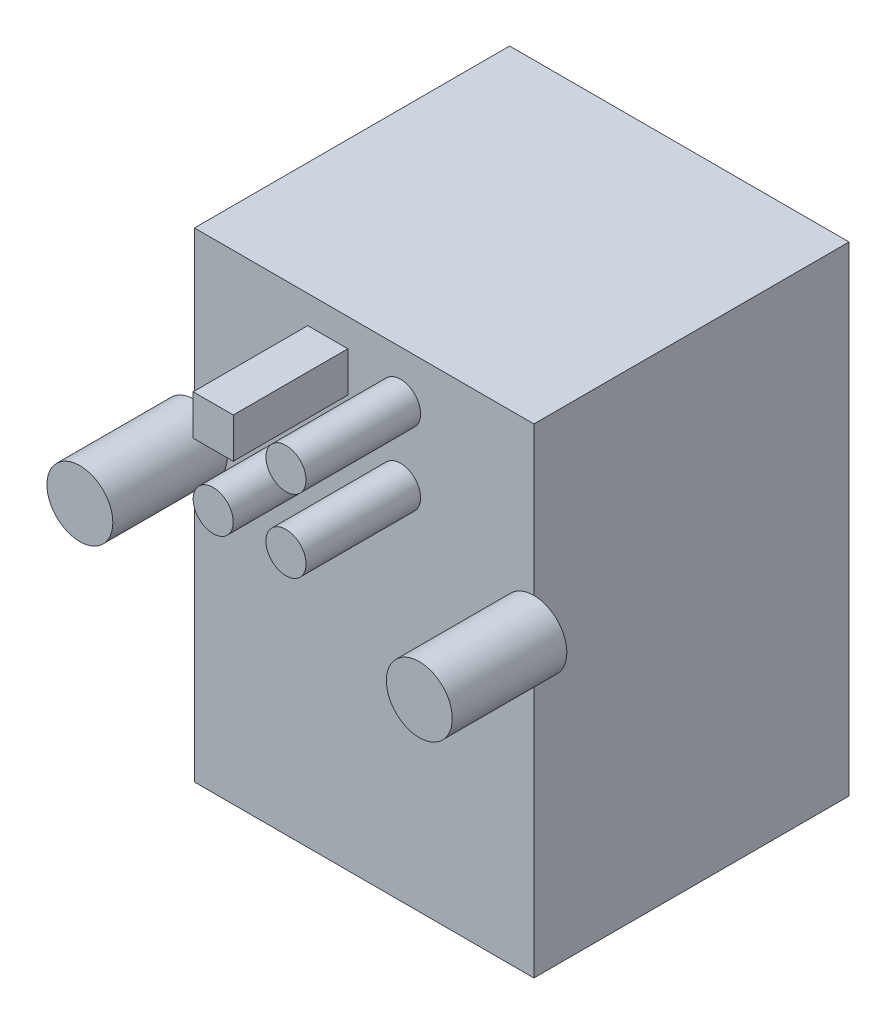
ISO-10303-21;
HEADER;
FILE_DESCRIPTION(('STEP AP214'),'2;1');
FILE_NAME('part.step','',(''),(''),'','','');
FILE_SCHEMA(('AUTOMOTIVE_DESIGN { 1 0 10303 214 1 1 1 1 }'));
ENDSEC;
DATA;
#1=APPLICATION_CONTEXT('core data for automotive mechanical design processes');
#2=APPLICATION_PROTOCOL_DEFINITION('international standard','automotive_design',2000,#1);
#3=PRODUCT_CONTEXT('',#1,'mechanical');
#4=PRODUCT('Part','Part','',(#3));
#5=PRODUCT_RELATED_PRODUCT_CATEGORY('part','',(#4));
#6=PRODUCT_DEFINITION_FORMATION('','',#4);
#7=PRODUCT_DEFINITION_CONTEXT('part definition',#1,'design');
#8=PRODUCT_DEFINITION('design','',#6,#7);
#9=PRODUCT_DEFINITION_SHAPE('','',#8);
#10=(LENGTH_UNIT() NAMED_UNIT(*) SI_UNIT(.MILLI.,.METRE.));
#11=(NAMED_UNIT(*) PLANE_ANGLE_UNIT() SI_UNIT($,.RADIAN.));
#12=(NAMED_UNIT(*) SI_UNIT($,.STERADIAN.) SOLID_ANGLE_UNIT());
#13=UNCERTAINTY_MEASURE_WITH_UNIT(LENGTH_MEASURE(1.E-05),#10,'distance_accuracy_value','');
#14=(GEOMETRIC_REPRESENTATION_CONTEXT(3) GLOBAL_UNCERTAINTY_ASSIGNED_CONTEXT((#13)) GLOBAL_UNIT_ASSIGNED_CONTEXT((#10,
#11,#12)) REPRESENTATION_CONTEXT('',''));
#15=CARTESIAN_POINT('',(0.,0.,0.));
#16=DIRECTION('',(0.,0.,1.));
#17=DIRECTION('',(1.,0.,0.));
#18=AXIS2_PLACEMENT_3D('',#15,#16,#17);
#19=CARTESIAN_POINT('',(0.,0.,0.));
#20=DIRECTION('',(0.,0.,1.));
#21=DIRECTION('',(1.,0.,0.));
#22=AXIS2_PLACEMENT_3D('',#19,#20,#21);
#23=PLANE('',#22);
#24=CARTESIAN_POINT('',(1.27000000000001,2.11751567556184,0.));
#25=DIRECTION('',(0.,0.,1.));
#26=DIRECTION('',(1.,0.,0.));
#27=AXIS2_PLACEMENT_3D('',#24,#25,#26);
#28=CIRCLE('',#27,0.6999986);
#29=CARTESIAN_POINT('',(1.96999860000001,2.11751567556184,0.));
#30=VERTEX_POINT('',#29);
#31=EDGE_CURVE('E147',#30,#30,#28,.T.);
#32=ORIENTED_EDGE('',*,*,#31,.F.);
#33=EDGE_LOOP('',(#32));
#34=FACE_BOUND('',#33,.T.);
#35=CARTESIAN_POINT('',(1.27000000000001,4.6575156755618,0.));
#36=DIRECTION('',(0.,0.,1.));
#37=DIRECTION('',(1.,0.,0.));
#38=AXIS2_PLACEMENT_3D('',#35,#36,#37);
#39=CIRCLE('',#38,0.6999986);
#40=CARTESIAN_POINT('',(1.96999860000001,4.6575156755618,0.));
#41=VERTEX_POINT('',#40);
#42=EDGE_CURVE('E181',#41,#41,#39,.T.);
#43=ORIENTED_EDGE('',*,*,#42,.F.);
#44=EDGE_LOOP('',(#43));
#45=FACE_BOUND('',#44,.T.);
#46=CARTESIAN_POINT('',(-1.26999999999996,2.11751567556184,0.));
#47=DIRECTION('',(0.,0.,1.));
#48=DIRECTION('',(1.,0.,0.));
#49=AXIS2_PLACEMENT_3D('',#46,#47,#48);
#50=CIRCLE('',#49,0.6999986);
#51=CARTESIAN_POINT('',(-0.570001399999959,2.11751567556184,0.));
#52=VERTEX_POINT('',#51);
#53=EDGE_CURVE('E184',#52,#52,#50,.T.);
#54=ORIENTED_EDGE('',*,*,#53,.F.);
#55=EDGE_LOOP('',(#54));
#56=FACE_BOUND('',#55,.T.);
#57=DIRECTION('',(0.,-1.,0.));
#58=VECTOR('',#57,1.);
#59=CARTESIAN_POINT('',(-5.92382396959285,6.33347917491492,0.));
#60=LINE('',#59,#58);
#61=CARTESIAN_POINT('',(-5.92382396959285,6.33347917491492,0.));
#62=VERTEX_POINT('',#61);
#63=CARTESIAN_POINT('',(-5.92382396959285,1.15001040000003,0.));
#64=VERTEX_POINT('',#63);
#65=EDGE_CURVE('E123',#62,#64,#60,.T.);
#66=ORIENTED_EDGE('',*,*,#65,.T.);
#67=CARTESIAN_POINT('',(-5.92382396959285,0.,0.));
#68=DIRECTION('',(0.,0.,1.));
#69=DIRECTION('',(1.,0.,0.));
#70=AXIS2_PLACEMENT_3D('',#67,#68,#69);
#71=CIRCLE('',#70,1.15001040000004);
#72=CARTESIAN_POINT('',(-5.92382396959285,-1.15001040000004,0.));
#73=VERTEX_POINT('',#72);
#74=EDGE_CURVE('E125',#73,#64,#71,.T.);
#75=ORIENTED_EDGE('',*,*,#74,.F.);
#76=CARTESIAN_POINT('',(-5.92382396959285,-10.4152500000001,0.));
#77=VERTEX_POINT('',#76);
#78=EDGE_CURVE('E113',#73,#77,#60,.T.);
#79=ORIENTED_EDGE('',*,*,#78,.T.);
#80=DIRECTION('',(1.,0.,0.));
#81=VECTOR('',#80,1.);
#82=CARTESIAN_POINT('',(-5.92382396959285,-10.4152500000001,0.));
#83=LINE('',#82,#81);
#84=CARTESIAN_POINT('',(5.92382396959283,-10.4152500000001,0.));
#85=VERTEX_POINT('',#84);
#86=EDGE_CURVE('E205',#77,#85,#83,.T.);
#87=ORIENTED_EDGE('',*,*,#86,.T.);
#88=DIRECTION('',(0.,1.,0.));
#89=VECTOR('',#88,1.);
#90=CARTESIAN_POINT('',(5.92382396959283,-10.4152500000001,0.));
#91=LINE('',#90,#89);
#92=CARTESIAN_POINT('',(5.92382396959283,-1.1500104,0.));
#93=VERTEX_POINT('',#92);
#94=EDGE_CURVE('E196',#85,#93,#91,.T.);
#95=ORIENTED_EDGE('',*,*,#94,.T.);
#96=CARTESIAN_POINT('',(5.92382396959282,0.,0.));
#97=DIRECTION('',(0.,0.,1.));
#98=DIRECTION('',(1.,0.,0.));
#99=AXIS2_PLACEMENT_3D('',#96,#97,#98);
#100=CIRCLE('',#99,1.1500104);
#101=CARTESIAN_POINT('',(5.92382396959283,1.1500104,0.));
#102=VERTEX_POINT('',#101);
#103=EDGE_CURVE('E148',#102,#93,#100,.T.);
#104=ORIENTED_EDGE('',*,*,#103,.F.);
#105=CARTESIAN_POINT('',(5.92382396959282,6.33347917491492,0.));
#106=VERTEX_POINT('',#105);
#107=EDGE_CURVE('E207',#102,#106,#91,.T.);
#108=ORIENTED_EDGE('',*,*,#107,.T.);
#109=DIRECTION('',(-1.,0.,0.));
#110=VECTOR('',#109,1.);
#111=CARTESIAN_POINT('',(5.92382396959282,6.33347917491492,0.));
#112=LINE('',#111,#110);
#113=EDGE_CURVE('E121',#106,#62,#112,.T.);
#114=ORIENTED_EDGE('',*,*,#113,.T.);
#115=EDGE_LOOP('',(#66,#75,#79,#87,#95,#104,#108,#114));
#116=FACE_BOUND('',#115,.T.);
#117=DIRECTION('',(0.,-1.,0.));
#118=VECTOR('',#117,1.);
#119=CARTESIAN_POINT('',(-1.96999860000003,0.,0.));
#120=LINE('',#119,#118);
#121=CARTESIAN_POINT('',(-1.96999860000003,5.35751427556182,0.));
#122=VERTEX_POINT('',#121);
#123=CARTESIAN_POINT('',(-1.96999860000003,3.95751707556179,0.));
#124=VERTEX_POINT('',#123);
#125=EDGE_CURVE('E168',#122,#124,#120,.T.);
#126=ORIENTED_EDGE('',*,*,#125,.F.);
#127=DIRECTION('',(-1.,0.,0.));
#128=VECTOR('',#127,1.);
#129=CARTESIAN_POINT('',(0.,5.35751427556182,0.));
#130=LINE('',#129,#128);
#131=CARTESIAN_POINT('',(-0.570001400000002,5.35751427556182,0.));
#132=VERTEX_POINT('',#131);
#133=EDGE_CURVE('E170',#132,#122,#130,.T.);
#134=ORIENTED_EDGE('',*,*,#133,.F.);
#135=DIRECTION('',(0.,1.,0.));
#136=VECTOR('',#135,1.);
#137=CARTESIAN_POINT('',(-0.570001400000003,0.,0.));
#138=LINE('',#137,#136);
#139=CARTESIAN_POINT('',(-0.570001400000002,3.95751707556179,0.));
#140=VERTEX_POINT('',#139);
#141=EDGE_CURVE('E162',#140,#132,#138,.T.);
#142=ORIENTED_EDGE('',*,*,#141,.F.);
#143=DIRECTION('',(1.,0.,0.));
#144=VECTOR('',#143,1.);
#145=CARTESIAN_POINT('',(0.,3.95751707556179,0.));
#146=LINE('',#145,#144);
#147=EDGE_CURVE('E164',#124,#140,#146,.T.);
#148=ORIENTED_EDGE('',*,*,#147,.F.);
#149=EDGE_LOOP('',(#126,#134,#142,#148));
#150=FACE_BOUND('',#149,.T.);
#151=ADVANCED_FACE('F34',(#34,#45,#56,#116,#150),#23,.T.);
#152=CARTESIAN_POINT('',(5.92382396959282,6.33347917491492,-11.));
#153=DIRECTION('',(0.,1.,0.));
#154=DIRECTION('',(0.,0.,1.));
#155=AXIS2_PLACEMENT_3D('',#152,#153,#154);
#156=PLANE('',#155);
#157=ORIENTED_EDGE('',*,*,#113,.F.);
#158=DIRECTION('',(0.,0.,1.));
#159=VECTOR('',#158,1.);
#160=CARTESIAN_POINT('',(5.92382396959282,6.33347917491492,-11.));
#161=LINE('',#160,#159);
#162=CARTESIAN_POINT('',(5.92382396959282,6.33347917491492,-11.));
#163=VERTEX_POINT('',#162);
#164=EDGE_CURVE('E11',#163,#106,#161,.T.);
#165=ORIENTED_EDGE('',*,*,#164,.F.);
#166=DIRECTION('',(-1.,0.,0.));
#167=VECTOR('',#166,1.);
#168=CARTESIAN_POINT('',(5.92382396959282,6.33347917491492,-11.));
#169=LINE('',#168,#167);
#170=CARTESIAN_POINT('',(-5.92382396959285,6.33347917491492,-11.));
#171=VERTEX_POINT('',#170);
#172=EDGE_CURVE('E192',#163,#171,#169,.T.);
#173=ORIENTED_EDGE('',*,*,#172,.T.);
#174=DIRECTION('',(0.,0.,1.));
#175=VECTOR('',#174,1.);
#176=CARTESIAN_POINT('',(-5.92382396959285,6.33347917491492,-11.));
#177=LINE('',#176,#175);
#178=EDGE_CURVE('E38',#171,#62,#177,.T.);
#179=ORIENTED_EDGE('',*,*,#178,.T.);
#180=EDGE_LOOP('',(#157,#165,#173,#179));
#181=FACE_BOUND('',#180,.T.);
#182=ADVANCED_FACE('F36',(#181),#156,.T.);
#183=CARTESIAN_POINT('',(5.92382396959283,-10.4152500000001,-11.));
#184=DIRECTION('',(1.,0.,0.));
#185=DIRECTION('',(0.,1.,0.));
#186=AXIS2_PLACEMENT_3D('',#183,#184,#185);
#187=PLANE('',#186);
#188=ORIENTED_EDGE('',*,*,#94,.F.);
#189=DIRECTION('',(0.,0.,1.));
#190=VECTOR('',#189,1.);
#191=CARTESIAN_POINT('',(5.92382396959283,-10.4152500000001,-11.));
#192=LINE('',#191,#190);
#193=CARTESIAN_POINT('',(5.92382396959283,-10.4152500000001,-11.));
#194=VERTEX_POINT('',#193);
#195=EDGE_CURVE('E43',#194,#85,#192,.T.);
#196=ORIENTED_EDGE('',*,*,#195,.F.);
#197=DIRECTION('',(0.,1.,0.));
#198=VECTOR('',#197,1.);
#199=CARTESIAN_POINT('',(5.92382396959283,-10.4152500000001,-11.));
#200=LINE('',#199,#198);
#201=EDGE_CURVE('E201',#194,#163,#200,.T.);
#202=ORIENTED_EDGE('',*,*,#201,.T.);
#203=ORIENTED_EDGE('',*,*,#164,.T.);
#204=ORIENTED_EDGE('',*,*,#107,.F.);
#205=EDGE_CURVE('E59',#93,#102,#91,.T.);
#206=ORIENTED_EDGE('',*,*,#205,.F.);
#207=EDGE_LOOP('',(#188,#196,#202,#203,#204,#206));
#208=FACE_BOUND('',#207,.T.);
#209=ADVANCED_FACE('F214',(#208),#187,.T.);
#210=CARTESIAN_POINT('',(-5.92382396959285,-10.4152500000001,-11.));
#211=DIRECTION('',(0.,-1.,0.));
#212=DIRECTION('',(0.,0.,-1.));
#213=AXIS2_PLACEMENT_3D('',#210,#211,#212);
#214=PLANE('',#213);
#215=ORIENTED_EDGE('',*,*,#86,.F.);
#216=DIRECTION('',(0.,0.,1.));
#217=VECTOR('',#216,1.);
#218=CARTESIAN_POINT('',(-5.92382396959285,-10.4152500000001,-11.));
#219=LINE('',#218,#217);
#220=CARTESIAN_POINT('',(-5.92382396959285,-10.4152500000001,-11.));
#221=VERTEX_POINT('',#220);
#222=EDGE_CURVE('E117',#221,#77,#219,.T.);
#223=ORIENTED_EDGE('',*,*,#222,.F.);
#224=DIRECTION('',(1.,0.,0.));
#225=VECTOR('',#224,1.);
#226=CARTESIAN_POINT('',(-5.92382396959285,-10.4152500000001,-11.));
#227=LINE('',#226,#225);
#228=EDGE_CURVE('E198',#221,#194,#227,.T.);
#229=ORIENTED_EDGE('',*,*,#228,.T.);
#230=ORIENTED_EDGE('',*,*,#195,.T.);
#231=EDGE_LOOP('',(#215,#223,#229,#230));
#232=FACE_BOUND('',#231,.T.);
#233=ADVANCED_FACE('F220',(#232),#214,.T.);
#234=CARTESIAN_POINT('',(-5.92382396959285,6.33347917491492,-11.));
#235=DIRECTION('',(-1.,0.,0.));
#236=DIRECTION('',(0.,-1.,0.));
#237=AXIS2_PLACEMENT_3D('',#234,#235,#236);
#238=PLANE('',#237);
#239=ORIENTED_EDGE('',*,*,#65,.F.);
#240=ORIENTED_EDGE('',*,*,#178,.F.);
#241=DIRECTION('',(0.,-1.,0.));
#242=VECTOR('',#241,1.);
#243=CARTESIAN_POINT('',(-5.92382396959285,6.33347917491492,-11.));
#244=LINE('',#243,#242);
#245=EDGE_CURVE('E195',#171,#221,#244,.T.);
#246=ORIENTED_EDGE('',*,*,#245,.T.);
#247=ORIENTED_EDGE('',*,*,#222,.T.);
#248=ORIENTED_EDGE('',*,*,#78,.F.);
#249=EDGE_CURVE('E51',#64,#73,#60,.T.);
#250=ORIENTED_EDGE('',*,*,#249,.F.);
#251=EDGE_LOOP('',(#239,#240,#246,#247,#248,#250));
#252=FACE_BOUND('',#251,.T.);
#253=ADVANCED_FACE('F115',(#252),#238,.T.);
#254=CARTESIAN_POINT('',(0.,0.,-11.));
#255=DIRECTION('',(0.,0.,1.));
#256=DIRECTION('',(1.,0.,0.));
#257=AXIS2_PLACEMENT_3D('',#254,#255,#256);
#258=PLANE('',#257);
#259=ORIENTED_EDGE('',*,*,#172,.F.);
#260=ORIENTED_EDGE('',*,*,#201,.F.);
#261=ORIENTED_EDGE('',*,*,#228,.F.);
#262=ORIENTED_EDGE('',*,*,#245,.F.);
#263=EDGE_LOOP('',(#259,#260,#261,#262));
#264=FACE_BOUND('',#263,.T.);
#265=ADVANCED_FACE('F217',(#264),#258,.F.);
#266=CARTESIAN_POINT('',(-1.26999999999996,2.11751567556184,4.));
#267=DIRECTION('',(0.,0.,-1.));
#268=DIRECTION('',(-1.,0.,0.));
#269=AXIS2_PLACEMENT_3D('',#266,#267,#268);
#270=CYLINDRICAL_SURFACE('',#269,0.6999986);
#271=CARTESIAN_POINT('',(-1.26999999999996,2.11751567556184,4.));
#272=DIRECTION('',(0.,0.,1.));
#273=DIRECTION('',(1.,0.,0.));
#274=AXIS2_PLACEMENT_3D('',#271,#272,#273);
#275=CIRCLE('',#274,0.6999986);
#276=CARTESIAN_POINT('',(-0.570001399999959,2.11751567556184,4.));
#277=VERTEX_POINT('',#276);
#278=EDGE_CURVE('E187',#277,#277,#275,.T.);
#279=ORIENTED_EDGE('',*,*,#278,.F.);
#280=EDGE_LOOP('',(#279));
#281=FACE_BOUND('',#280,.T.);
#282=ORIENTED_EDGE('',*,*,#53,.T.);
#283=EDGE_LOOP('',(#282));
#284=FACE_BOUND('',#283,.T.);
#285=ADVANCED_FACE('F262',(#281,#284),#270,.T.);
#286=CARTESIAN_POINT('',(0.,0.,4.));
#287=DIRECTION('',(0.,0.,1.));
#288=DIRECTION('',(1.,0.,0.));
#289=AXIS2_PLACEMENT_3D('',#286,#287,#288);
#290=PLANE('',#289);
#291=ORIENTED_EDGE('',*,*,#278,.T.);
#292=EDGE_LOOP('',(#291));
#293=FACE_BOUND('',#292,.T.);
#294=ADVANCED_FACE('F266',(#293),#290,.T.);
#295=CARTESIAN_POINT('',(1.27000000000001,4.6575156755618,4.));
#296=DIRECTION('',(0.,0.,-1.));
#297=DIRECTION('',(-1.,0.,0.));
#298=AXIS2_PLACEMENT_3D('',#295,#296,#297);
#299=CYLINDRICAL_SURFACE('',#298,0.6999986);
#300=CARTESIAN_POINT('',(1.27000000000001,4.6575156755618,4.));
#301=DIRECTION('',(0.,0.,1.));
#302=DIRECTION('',(1.,0.,0.));
#303=AXIS2_PLACEMENT_3D('',#300,#301,#302);
#304=CIRCLE('',#303,0.6999986);
#305=CARTESIAN_POINT('',(1.96999860000001,4.6575156755618,4.));
#306=VERTEX_POINT('',#305);
#307=EDGE_CURVE('E173',#306,#306,#304,.T.);
#308=ORIENTED_EDGE('',*,*,#307,.F.);
#309=EDGE_LOOP('',(#308));
#310=FACE_BOUND('',#309,.T.);
#311=ORIENTED_EDGE('',*,*,#42,.T.);
#312=EDGE_LOOP('',(#311));
#313=FACE_BOUND('',#312,.T.);
#314=ADVANCED_FACE('F271',(#310,#313),#299,.T.);
#315=CARTESIAN_POINT('',(0.,0.,4.));
#316=DIRECTION('',(0.,0.,1.));
#317=DIRECTION('',(1.,0.,0.));
#318=AXIS2_PLACEMENT_3D('',#315,#316,#317);
#319=PLANE('',#318);
#320=ORIENTED_EDGE('',*,*,#307,.T.);
#321=EDGE_LOOP('',(#320));
#322=FACE_BOUND('',#321,.T.);
#323=ADVANCED_FACE('F277',(#322),#319,.T.);
#324=CARTESIAN_POINT('',(0.,5.35751427556182,4.));
#325=DIRECTION('',(0.,-1.,0.));
#326=DIRECTION('',(0.,0.,-1.));
#327=AXIS2_PLACEMENT_3D('',#324,#325,#326);
#328=PLANE('',#327);
#329=ORIENTED_EDGE('',*,*,#133,.T.);
#330=DIRECTION('',(0.,0.,-1.));
#331=VECTOR('',#330,1.);
#332=CARTESIAN_POINT('',(-1.96999860000003,5.35751427556182,4.));
#333=LINE('',#332,#331);
#334=CARTESIAN_POINT('',(-1.96999860000003,5.35751427556182,4.));
#335=VERTEX_POINT('',#334);
#336=EDGE_CURVE('E150',#335,#122,#333,.T.);
#337=ORIENTED_EDGE('',*,*,#336,.F.);
#338=DIRECTION('',(-1.,0.,0.));
#339=VECTOR('',#338,1.);
#340=CARTESIAN_POINT('',(0.,5.35751427556182,4.));
#341=LINE('',#340,#339);
#342=CARTESIAN_POINT('',(-0.570001400000002,5.35751427556182,4.));
#343=VERTEX_POINT('',#342);
#344=EDGE_CURVE('E165',#343,#335,#341,.T.);
#345=ORIENTED_EDGE('',*,*,#344,.F.);
#346=DIRECTION('',(0.,0.,-1.));
#347=VECTOR('',#346,1.);
#348=CARTESIAN_POINT('',(-0.570001400000002,5.35751427556182,4.));
#349=LINE('',#348,#347);
#350=EDGE_CURVE('E158',#343,#132,#349,.T.);
#351=ORIENTED_EDGE('',*,*,#350,.T.);
#352=EDGE_LOOP('',(#329,#337,#345,#351));
#353=FACE_BOUND('',#352,.T.);
#354=ADVANCED_FACE('F280',(#353),#328,.F.);
#355=CARTESIAN_POINT('',(-1.96999860000003,0.,4.));
#356=DIRECTION('',(1.,0.,0.));
#357=DIRECTION('',(0.,1.,0.));
#358=AXIS2_PLACEMENT_3D('',#355,#356,#357);
#359=PLANE('',#358);
#360=ORIENTED_EDGE('',*,*,#125,.T.);
#361=DIRECTION('',(0.,0.,-1.));
#362=VECTOR('',#361,1.);
#363=CARTESIAN_POINT('',(-1.96999860000003,3.95751707556179,4.));
#364=LINE('',#363,#362);
#365=CARTESIAN_POINT('',(-1.96999860000003,3.95751707556179,4.));
#366=VERTEX_POINT('',#365);
#367=EDGE_CURVE('E153',#366,#124,#364,.T.);
#368=ORIENTED_EDGE('',*,*,#367,.F.);
#369=DIRECTION('',(0.,-1.,0.));
#370=VECTOR('',#369,1.);
#371=CARTESIAN_POINT('',(-1.96999860000003,0.,4.));
#372=LINE('',#371,#370);
#373=EDGE_CURVE('E177',#335,#366,#372,.T.);
#374=ORIENTED_EDGE('',*,*,#373,.F.);
#375=ORIENTED_EDGE('',*,*,#336,.T.);
#376=EDGE_LOOP('',(#360,#368,#374,#375));
#377=FACE_BOUND('',#376,.T.);
#378=ADVANCED_FACE('F291',(#377),#359,.F.);
#379=CARTESIAN_POINT('',(0.,3.95751707556179,4.));
#380=DIRECTION('',(0.,1.,0.));
#381=DIRECTION('',(0.,0.,1.));
#382=AXIS2_PLACEMENT_3D('',#379,#380,#381);
#383=PLANE('',#382);
#384=ORIENTED_EDGE('',*,*,#147,.T.);
#385=DIRECTION('',(0.,0.,-1.));
#386=VECTOR('',#385,1.);
#387=CARTESIAN_POINT('',(-0.570001400000002,3.95751707556179,4.));
#388=LINE('',#387,#386);
#389=CARTESIAN_POINT('',(-0.570001400000002,3.95751707556179,4.));
#390=VERTEX_POINT('',#389);
#391=EDGE_CURVE('E156',#390,#140,#388,.T.);
#392=ORIENTED_EDGE('',*,*,#391,.F.);
#393=DIRECTION('',(1.,0.,0.));
#394=VECTOR('',#393,1.);
#395=CARTESIAN_POINT('',(0.,3.95751707556179,4.));
#396=LINE('',#395,#394);
#397=EDGE_CURVE('E175',#366,#390,#396,.T.);
#398=ORIENTED_EDGE('',*,*,#397,.F.);
#399=ORIENTED_EDGE('',*,*,#367,.T.);
#400=EDGE_LOOP('',(#384,#392,#398,#399));
#401=FACE_BOUND('',#400,.T.);
#402=ADVANCED_FACE('F287',(#401),#383,.F.);
#403=CARTESIAN_POINT('',(-0.570001400000003,0.,4.));
#404=DIRECTION('',(-1.,0.,0.));
#405=DIRECTION('',(0.,-1.,0.));
#406=AXIS2_PLACEMENT_3D('',#403,#404,#405);
#407=PLANE('',#406);
#408=ORIENTED_EDGE('',*,*,#141,.T.);
#409=ORIENTED_EDGE('',*,*,#350,.F.);
#410=DIRECTION('',(0.,1.,0.));
#411=VECTOR('',#410,1.);
#412=CARTESIAN_POINT('',(-0.570001400000003,0.,4.));
#413=LINE('',#412,#411);
#414=EDGE_CURVE('E161',#390,#343,#413,.T.);
#415=ORIENTED_EDGE('',*,*,#414,.F.);
#416=ORIENTED_EDGE('',*,*,#391,.T.);
#417=EDGE_LOOP('',(#408,#409,#415,#416));
#418=FACE_BOUND('',#417,.T.);
#419=ADVANCED_FACE('F238',(#418),#407,.F.);
#420=CARTESIAN_POINT('',(0.,0.,4.));
#421=DIRECTION('',(0.,0.,1.));
#422=DIRECTION('',(1.,0.,0.));
#423=AXIS2_PLACEMENT_3D('',#420,#421,#422);
#424=PLANE('',#423);
#425=ORIENTED_EDGE('',*,*,#344,.T.);
#426=ORIENTED_EDGE('',*,*,#373,.T.);
#427=ORIENTED_EDGE('',*,*,#397,.T.);
#428=ORIENTED_EDGE('',*,*,#414,.T.);
#429=EDGE_LOOP('',(#425,#426,#427,#428));
#430=FACE_BOUND('',#429,.T.);
#431=ADVANCED_FACE('F229',(#430),#424,.T.);
#432=CARTESIAN_POINT('',(5.92382396959282,0.,4.));
#433=DIRECTION('',(0.,0.,-1.));
#434=DIRECTION('',(-1.,0.,0.));
#435=AXIS2_PLACEMENT_3D('',#432,#433,#434);
#436=CYLINDRICAL_SURFACE('',#435,1.1500104);
#437=CARTESIAN_POINT('',(5.92382396959282,0.,4.));
#438=DIRECTION('',(0.,0.,1.));
#439=DIRECTION('',(1.,0.,0.));
#440=AXIS2_PLACEMENT_3D('',#437,#438,#439);
#441=CIRCLE('',#440,1.1500104);
#442=CARTESIAN_POINT('',(7.07383436959282,0.,4.));
#443=VERTEX_POINT('',#442);
#444=EDGE_CURVE('E137',#443,#443,#441,.T.);
#445=ORIENTED_EDGE('',*,*,#444,.F.);
#446=EDGE_LOOP('',(#445));
#447=FACE_BOUND('',#446,.T.);
#448=ORIENTED_EDGE('',*,*,#103,.T.);
#449=EDGE_CURVE('E139',#93,#102,#100,.T.);
#450=ORIENTED_EDGE('',*,*,#449,.T.);
#451=EDGE_LOOP('',(#448,#450));
#452=FACE_BOUND('',#451,.T.);
#453=ADVANCED_FACE('F226',(#447,#452),#436,.T.);
#454=CARTESIAN_POINT('',(0.,0.,4.));
#455=DIRECTION('',(0.,0.,1.));
#456=DIRECTION('',(1.,0.,0.));
#457=AXIS2_PLACEMENT_3D('',#454,#455,#456);
#458=PLANE('',#457);
#459=ORIENTED_EDGE('',*,*,#444,.T.);
#460=EDGE_LOOP('',(#459));
#461=FACE_BOUND('',#460,.T.);
#462=ADVANCED_FACE('F228',(#461),#458,.T.);
#463=CARTESIAN_POINT('',(0.,0.,0.));
#464=DIRECTION('',(0.,0.,1.));
#465=DIRECTION('',(1.,0.,0.));
#466=AXIS2_PLACEMENT_3D('',#463,#464,#465);
#467=PLANE('',#466);
#468=ORIENTED_EDGE('',*,*,#205,.T.);
#469=ORIENTED_EDGE('',*,*,#449,.F.);
#470=EDGE_LOOP('',(#468,#469));
#471=FACE_BOUND('',#470,.T.);
#472=ADVANCED_FACE('F224',(#471),#467,.F.);
#473=CARTESIAN_POINT('',(-5.92382396959285,0.,4.));
#474=DIRECTION('',(0.,0.,-1.));
#475=DIRECTION('',(-1.,0.,0.));
#476=AXIS2_PLACEMENT_3D('',#473,#474,#475);
#477=CYLINDRICAL_SURFACE('',#476,1.15001040000004);
#478=CARTESIAN_POINT('',(-5.92382396959285,0.,4.));
#479=DIRECTION('',(0.,0.,1.));
#480=DIRECTION('',(1.,0.,0.));
#481=AXIS2_PLACEMENT_3D('',#478,#479,#480);
#482=CIRCLE('',#481,1.15001040000004);
#483=CARTESIAN_POINT('',(-4.77381356959282,0.,4.));
#484=VERTEX_POINT('',#483);
#485=EDGE_CURVE('E132',#484,#484,#482,.T.);
#486=ORIENTED_EDGE('',*,*,#485,.F.);
#487=EDGE_LOOP('',(#486));
#488=FACE_BOUND('',#487,.T.);
#489=EDGE_CURVE('E131',#64,#73,#71,.T.);
#490=ORIENTED_EDGE('',*,*,#489,.T.);
#491=ORIENTED_EDGE('',*,*,#74,.T.);
#492=EDGE_LOOP('',(#490,#491));
#493=FACE_BOUND('',#492,.T.);
#494=ADVANCED_FACE('F136',(#488,#493),#477,.T.);
#495=CARTESIAN_POINT('',(-5.92382396959285,0.,4.));
#496=DIRECTION('',(0.,0.,1.));
#497=DIRECTION('',(1.,0.,0.));
#498=AXIS2_PLACEMENT_3D('',#495,#496,#497);
#499=PLANE('',#498);
#500=ORIENTED_EDGE('',*,*,#485,.T.);
#501=EDGE_LOOP('',(#500));
#502=FACE_BOUND('',#501,.T.);
#503=ADVANCED_FACE('F302',(#502),#499,.T.);
#504=CARTESIAN_POINT('',(-5.92382396959285,0.,0.));
#505=DIRECTION('',(0.,0.,1.));
#506=DIRECTION('',(1.,0.,0.));
#507=AXIS2_PLACEMENT_3D('',#504,#505,#506);
#508=PLANE('',#507);
#509=ORIENTED_EDGE('',*,*,#249,.T.);
#510=ORIENTED_EDGE('',*,*,#489,.F.);
#511=EDGE_LOOP('',(#509,#510));
#512=FACE_BOUND('',#511,.T.);
#513=ADVANCED_FACE('F135',(#512),#508,.F.);
#514=CARTESIAN_POINT('',(1.27000000000001,2.11751567556184,4.));
#515=DIRECTION('',(0.,0.,-1.));
#516=DIRECTION('',(-1.,0.,0.));
#517=AXIS2_PLACEMENT_3D('',#514,#515,#516);
#518=CYLINDRICAL_SURFACE('',#517,0.6999986);
#519=CARTESIAN_POINT('',(1.27000000000001,2.11751567556184,4.));
#520=DIRECTION('',(0.,0.,1.));
#521=DIRECTION('',(1.,0.,0.));
#522=AXIS2_PLACEMENT_3D('',#519,#520,#521);
#523=CIRCLE('',#522,0.6999986);
#524=CARTESIAN_POINT('',(1.96999860000001,2.11751567556184,4.));
#525=VERTEX_POINT('',#524);
#526=EDGE_CURVE('E143',#525,#525,#523,.T.);
#527=ORIENTED_EDGE('',*,*,#526,.F.);
#528=EDGE_LOOP('',(#527));
#529=FACE_BOUND('',#528,.T.);
#530=ORIENTED_EDGE('',*,*,#31,.T.);
#531=EDGE_LOOP('',(#530));
#532=FACE_BOUND('',#531,.T.);
#533=ADVANCED_FACE('F315',(#529,#532),#518,.T.);
#534=CARTESIAN_POINT('',(1.27000000000001,2.11751567556184,4.));
#535=DIRECTION('',(0.,0.,1.));
#536=DIRECTION('',(1.,0.,0.));
#537=AXIS2_PLACEMENT_3D('',#534,#535,#536);
#538=PLANE('',#537);
#539=ORIENTED_EDGE('',*,*,#526,.T.);
#540=EDGE_LOOP('',(#539));
#541=FACE_BOUND('',#540,.T.);
#542=ADVANCED_FACE('F312',(#541),#538,.T.);
#543=CLOSED_SHELL('',(#151,#182,#209,#233,#253,#265,#285,#294,#314,#323,#354,#378,#402,#419,
#431,#453,#462,#472,#494,#503,#513,#533,#542));
#544=MANIFOLD_SOLID_BREP('B2',#543);
#545=ADVANCED_BREP_SHAPE_REPRESENTATION('',(#18,#544),#14);
#546=SHAPE_DEFINITION_REPRESENTATION(#9,#545);
ENDSEC;
END-ISO-10303-21;
